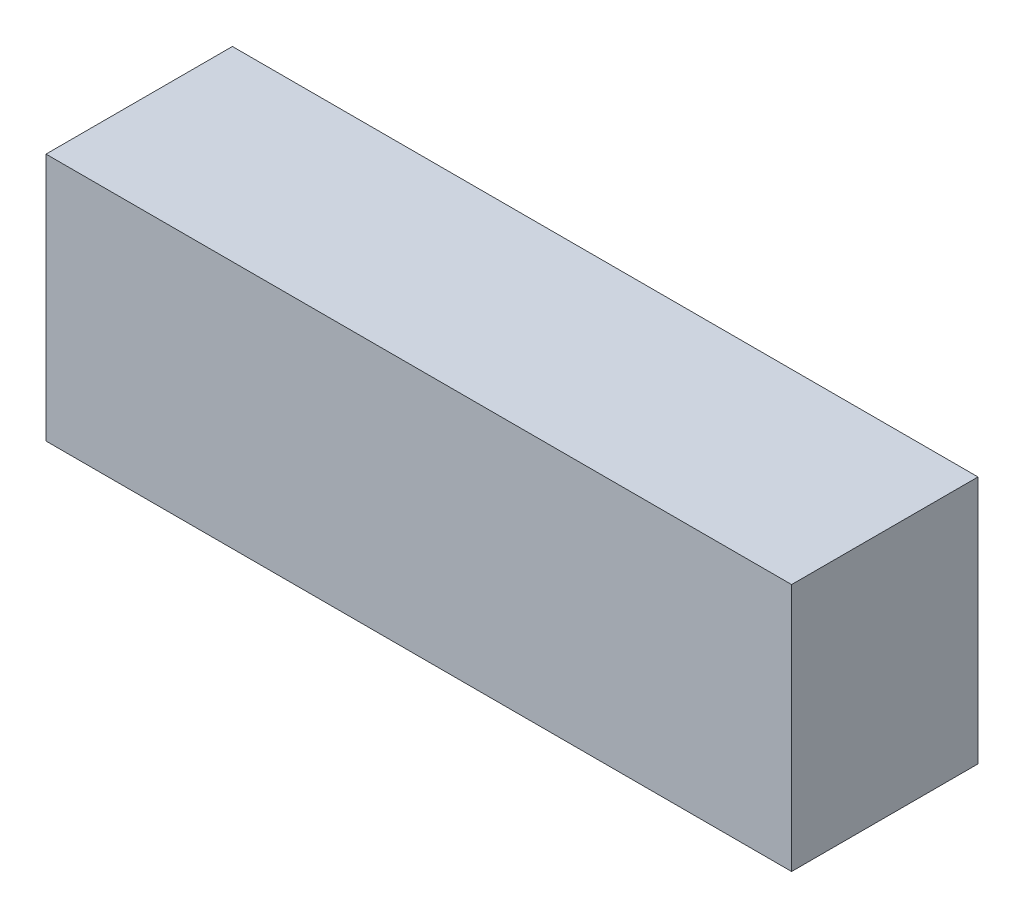
ISO-10303-21;
HEADER;
FILE_DESCRIPTION(('STEP AP214'),'2;1');
FILE_NAME('part.step','',(''),(''),'','','');
FILE_SCHEMA(('AUTOMOTIVE_DESIGN { 1 0 10303 214 1 1 1 1 }'));
ENDSEC;
DATA;
#1=APPLICATION_CONTEXT('core data for automotive mechanical design processes');
#2=APPLICATION_PROTOCOL_DEFINITION('international standard','automotive_design',2000,#1);
#3=PRODUCT_CONTEXT('',#1,'mechanical');
#4=PRODUCT('Part','Part','',(#3));
#5=PRODUCT_RELATED_PRODUCT_CATEGORY('part','',(#4));
#6=PRODUCT_DEFINITION_FORMATION('','',#4);
#7=PRODUCT_DEFINITION_CONTEXT('part definition',#1,'design');
#8=PRODUCT_DEFINITION('design','',#6,#7);
#9=PRODUCT_DEFINITION_SHAPE('','',#8);
#10=(LENGTH_UNIT() NAMED_UNIT(*) SI_UNIT(.MILLI.,.METRE.));
#11=(NAMED_UNIT(*) PLANE_ANGLE_UNIT() SI_UNIT($,.RADIAN.));
#12=(NAMED_UNIT(*) SI_UNIT($,.STERADIAN.) SOLID_ANGLE_UNIT());
#13=UNCERTAINTY_MEASURE_WITH_UNIT(LENGTH_MEASURE(1.E-05),#10,'distance_accuracy_value','');
#14=(GEOMETRIC_REPRESENTATION_CONTEXT(3) GLOBAL_UNCERTAINTY_ASSIGNED_CONTEXT((#13)) GLOBAL_UNIT_ASSIGNED_CONTEXT((#10,
#11,#12)) REPRESENTATION_CONTEXT('',''));
#15=CARTESIAN_POINT('',(0.,0.,0.));
#16=DIRECTION('',(0.,0.,1.));
#17=DIRECTION('',(1.,0.,0.));
#18=AXIS2_PLACEMENT_3D('',#15,#16,#17);
#19=CARTESIAN_POINT('',(19.05,6.35,9.525));
#20=DIRECTION('',(-1.,0.,0.));
#21=DIRECTION('',(0.,-1.,0.));
#22=AXIS2_PLACEMENT_3D('',#19,#20,#21);
#23=PLANE('',#22);
#24=DIRECTION('',(0.,1.,0.));
#25=VECTOR('',#24,1.);
#26=CARTESIAN_POINT('',(19.05,6.35,0.));
#27=LINE('',#26,#25);
#28=CARTESIAN_POINT('',(19.05,-6.35,0.));
#29=VERTEX_POINT('',#28);
#30=CARTESIAN_POINT('',(19.05,6.35,0.));
#31=VERTEX_POINT('',#30);
#32=EDGE_CURVE('E102',#29,#31,#27,.T.);
#33=ORIENTED_EDGE('',*,*,#32,.T.);
#34=DIRECTION('',(0.,0.,-1.));
#35=VECTOR('',#34,1.);
#36=CARTESIAN_POINT('',(19.05,6.35,9.525));
#37=LINE('',#36,#35);
#38=CARTESIAN_POINT('',(19.05,6.35,9.525));
#39=VERTEX_POINT('',#38);
#40=EDGE_CURVE('E11',#39,#31,#37,.T.);
#41=ORIENTED_EDGE('',*,*,#40,.F.);
#42=DIRECTION('',(0.,1.,0.));
#43=VECTOR('',#42,1.);
#44=CARTESIAN_POINT('',(19.05,6.35,9.525));
#45=LINE('',#44,#43);
#46=CARTESIAN_POINT('',(19.05,-6.35,9.525));
#47=VERTEX_POINT('',#46);
#48=EDGE_CURVE('E90',#47,#39,#45,.T.);
#49=ORIENTED_EDGE('',*,*,#48,.F.);
#50=DIRECTION('',(0.,0.,-1.));
#51=VECTOR('',#50,1.);
#52=CARTESIAN_POINT('',(19.05,-6.35,9.525));
#53=LINE('',#52,#51);
#54=EDGE_CURVE('E98',#47,#29,#53,.T.);
#55=ORIENTED_EDGE('',*,*,#54,.T.);
#56=EDGE_LOOP('',(#33,#41,#49,#55));
#57=FACE_BOUND('',#56,.T.);
#58=ADVANCED_FACE('F39',(#57),#23,.F.);
#59=CARTESIAN_POINT('',(-19.05,6.35,9.525));
#60=DIRECTION('',(0.,-1.,0.));
#61=DIRECTION('',(0.,0.,-1.));
#62=AXIS2_PLACEMENT_3D('',#59,#60,#61);
#63=PLANE('',#62);
#64=DIRECTION('',(-1.,0.,0.));
#65=VECTOR('',#64,1.);
#66=CARTESIAN_POINT('',(-19.05,6.35,0.));
#67=LINE('',#66,#65);
#68=CARTESIAN_POINT('',(-19.05,6.35,0.));
#69=VERTEX_POINT('',#68);
#70=EDGE_CURVE('E94',#31,#69,#67,.T.);
#71=ORIENTED_EDGE('',*,*,#70,.T.);
#72=DIRECTION('',(0.,0.,-1.));
#73=VECTOR('',#72,1.);
#74=CARTESIAN_POINT('',(-19.05,6.35,9.525));
#75=LINE('',#74,#73);
#76=CARTESIAN_POINT('',(-19.05,6.35,9.525));
#77=VERTEX_POINT('',#76);
#78=EDGE_CURVE('E47',#77,#69,#75,.T.);
#79=ORIENTED_EDGE('',*,*,#78,.F.);
#80=DIRECTION('',(-1.,0.,0.));
#81=VECTOR('',#80,1.);
#82=CARTESIAN_POINT('',(-19.05,6.35,9.525));
#83=LINE('',#82,#81);
#84=EDGE_CURVE('E85',#39,#77,#83,.T.);
#85=ORIENTED_EDGE('',*,*,#84,.F.);
#86=ORIENTED_EDGE('',*,*,#40,.T.);
#87=EDGE_LOOP('',(#71,#79,#85,#86));
#88=FACE_BOUND('',#87,.T.);
#89=ADVANCED_FACE('F93',(#88),#63,.F.);
#90=CARTESIAN_POINT('',(-19.05,6.35,9.525));
#91=DIRECTION('',(1.,0.,0.));
#92=DIRECTION('',(0.,0.,-1.));
#93=AXIS2_PLACEMENT_3D('',#90,#91,#92);
#94=PLANE('',#93);
#95=DIRECTION('',(0.,-1.,0.));
#96=VECTOR('',#95,1.);
#97=CARTESIAN_POINT('',(-19.05,6.35,0.));
#98=LINE('',#97,#96);
#99=CARTESIAN_POINT('',(-19.05,-6.35,0.));
#100=VERTEX_POINT('',#99);
#101=EDGE_CURVE('E72',#69,#100,#98,.T.);
#102=ORIENTED_EDGE('',*,*,#101,.T.);
#103=DIRECTION('',(0.,0.,-1.));
#104=VECTOR('',#103,1.);
#105=CARTESIAN_POINT('',(-19.05,-6.35,9.525));
#106=LINE('',#105,#104);
#107=CARTESIAN_POINT('',(-19.05,-6.35,9.525));
#108=VERTEX_POINT('',#107);
#109=EDGE_CURVE('E95',#108,#100,#106,.T.);
#110=ORIENTED_EDGE('',*,*,#109,.F.);
#111=DIRECTION('',(0.,-1.,0.));
#112=VECTOR('',#111,1.);
#113=CARTESIAN_POINT('',(-19.05,6.35,9.525));
#114=LINE('',#113,#112);
#115=EDGE_CURVE('E88',#77,#108,#114,.T.);
#116=ORIENTED_EDGE('',*,*,#115,.F.);
#117=ORIENTED_EDGE('',*,*,#78,.T.);
#118=EDGE_LOOP('',(#102,#110,#116,#117));
#119=FACE_BOUND('',#118,.T.);
#120=ADVANCED_FACE('F96',(#119),#94,.F.);
#121=CARTESIAN_POINT('',(-19.05,-6.35,9.525));
#122=DIRECTION('',(0.,1.,0.));
#123=DIRECTION('',(0.,0.,1.));
#124=AXIS2_PLACEMENT_3D('',#121,#122,#123);
#125=PLANE('',#124);
#126=DIRECTION('',(1.,0.,0.));
#127=VECTOR('',#126,1.);
#128=CARTESIAN_POINT('',(-19.05,-6.35,0.));
#129=LINE('',#128,#127);
#130=EDGE_CURVE('E78',#100,#29,#129,.T.);
#131=ORIENTED_EDGE('',*,*,#130,.T.);
#132=ORIENTED_EDGE('',*,*,#54,.F.);
#133=DIRECTION('',(1.,0.,0.));
#134=VECTOR('',#133,1.);
#135=CARTESIAN_POINT('',(-19.05,-6.35,9.525));
#136=LINE('',#135,#134);
#137=EDGE_CURVE('E55',#108,#47,#136,.T.);
#138=ORIENTED_EDGE('',*,*,#137,.F.);
#139=ORIENTED_EDGE('',*,*,#109,.T.);
#140=EDGE_LOOP('',(#131,#132,#138,#139));
#141=FACE_BOUND('',#140,.T.);
#142=ADVANCED_FACE('F109',(#141),#125,.F.);
#143=CARTESIAN_POINT('',(0.,0.,9.525));
#144=DIRECTION('',(0.,0.,1.));
#145=DIRECTION('',(1.,0.,0.));
#146=AXIS2_PLACEMENT_3D('',#143,#144,#145);
#147=PLANE('',#146);
#148=ORIENTED_EDGE('',*,*,#48,.T.);
#149=ORIENTED_EDGE('',*,*,#84,.T.);
#150=ORIENTED_EDGE('',*,*,#115,.T.);
#151=ORIENTED_EDGE('',*,*,#137,.T.);
#152=EDGE_LOOP('',(#148,#149,#150,#151));
#153=FACE_BOUND('',#152,.T.);
#154=ADVANCED_FACE('F86',(#153),#147,.T.);
#155=CARTESIAN_POINT('',(0.,0.,0.));
#156=DIRECTION('',(0.,0.,1.));
#157=DIRECTION('',(1.,0.,0.));
#158=AXIS2_PLACEMENT_3D('',#155,#156,#157);
#159=PLANE('',#158);
#160=ORIENTED_EDGE('',*,*,#32,.F.);
#161=ORIENTED_EDGE('',*,*,#130,.F.);
#162=ORIENTED_EDGE('',*,*,#101,.F.);
#163=ORIENTED_EDGE('',*,*,#70,.F.);
#164=EDGE_LOOP('',(#160,#161,#162,#163));
#165=FACE_BOUND('',#164,.T.);
#166=ADVANCED_FACE('F112',(#165),#159,.F.);
#167=CLOSED_SHELL('',(#58,#89,#120,#142,#154,#166));
#168=MANIFOLD_SOLID_BREP('B2',#167);
#169=ADVANCED_BREP_SHAPE_REPRESENTATION('',(#18,#168),#14);
#170=SHAPE_DEFINITION_REPRESENTATION(#9,#169);
ENDSEC;
END-ISO-10303-21;
